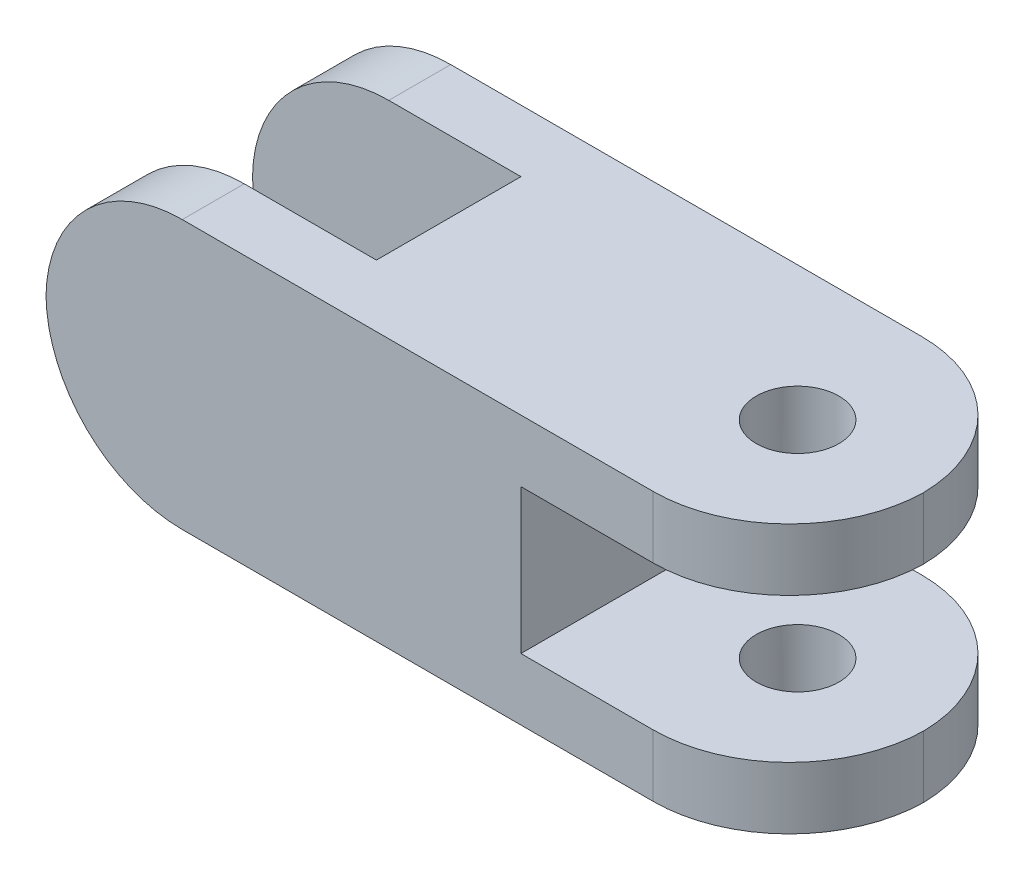
ISO-10303-21;
HEADER;
FILE_DESCRIPTION(('STEP AP214'),'2;1');
FILE_NAME('part.step','',(''),(''),'','','');
FILE_SCHEMA(('AUTOMOTIVE_DESIGN { 1 0 10303 214 1 1 1 1 }'));
ENDSEC;
DATA;
#1=APPLICATION_CONTEXT('core data for automotive mechanical design processes');
#2=APPLICATION_PROTOCOL_DEFINITION('international standard','automotive_design',2000,#1);
#3=PRODUCT_CONTEXT('',#1,'mechanical');
#4=PRODUCT('Part','Part','',(#3));
#5=PRODUCT_RELATED_PRODUCT_CATEGORY('part','',(#4));
#6=PRODUCT_DEFINITION_FORMATION('','',#4);
#7=PRODUCT_DEFINITION_CONTEXT('part definition',#1,'design');
#8=PRODUCT_DEFINITION('design','',#6,#7);
#9=PRODUCT_DEFINITION_SHAPE('','',#8);
#10=(LENGTH_UNIT() NAMED_UNIT(*) SI_UNIT(.MILLI.,.METRE.));
#11=(NAMED_UNIT(*) PLANE_ANGLE_UNIT() SI_UNIT($,.RADIAN.));
#12=(NAMED_UNIT(*) SI_UNIT($,.STERADIAN.) SOLID_ANGLE_UNIT());
#13=UNCERTAINTY_MEASURE_WITH_UNIT(LENGTH_MEASURE(1.E-05),#10,'distance_accuracy_value','');
#14=(GEOMETRIC_REPRESENTATION_CONTEXT(3) GLOBAL_UNCERTAINTY_ASSIGNED_CONTEXT((#13)) GLOBAL_UNIT_ASSIGNED_CONTEXT((#10,
#11,#12)) REPRESENTATION_CONTEXT('',''));
#15=CARTESIAN_POINT('',(0.,0.,0.));
#16=DIRECTION('',(0.,0.,1.));
#17=DIRECTION('',(1.,0.,0.));
#18=AXIS2_PLACEMENT_3D('',#15,#16,#17);
#19=CARTESIAN_POINT('',(-57.,-0.500000000000014,0.));
#20=DIRECTION('',(0.,0.,-1.));
#21=DIRECTION('',(-1.,0.,0.));
#22=AXIS2_PLACEMENT_3D('',#19,#20,#21);
#23=CYLINDRICAL_SURFACE('',#22,33.);
#24=DIRECTION('',(0.,0.,-1.));
#25=VECTOR('',#24,1.);
#26=CARTESIAN_POINT('',(-89.9962119037928,0.,0.));
#27=LINE('',#26,#25);
#28=CARTESIAN_POINT('',(-89.9962119037928,0.,-17.5));
#29=VERTEX_POINT('',#28);
#30=CARTESIAN_POINT('',(-89.9962119037928,0.,-32.5));
#31=VERTEX_POINT('',#30);
#32=EDGE_CURVE('E58',#29,#31,#27,.T.);
#33=ORIENTED_EDGE('',*,*,#32,.F.);
#34=CARTESIAN_POINT('',(-57.,-0.500000000000014,-17.5));
#35=DIRECTION('',(0.,0.,1.));
#36=DIRECTION('',(1.,0.,0.));
#37=AXIS2_PLACEMENT_3D('',#34,#35,#36);
#38=CIRCLE('',#37,33.);
#39=CARTESIAN_POINT('',(-57.,32.5,-17.5));
#40=VERTEX_POINT('',#39);
#41=EDGE_CURVE('E51',#29,#40,#38,.F.);
#42=ORIENTED_EDGE('',*,*,#41,.T.);
#43=DIRECTION('',(0.,0.,1.));
#44=VECTOR('',#43,1.);
#45=CARTESIAN_POINT('',(-57.,32.5,32.5));
#46=LINE('',#45,#44);
#47=CARTESIAN_POINT('',(-57.,32.5,-32.5));
#48=VERTEX_POINT('',#47);
#49=EDGE_CURVE('E266',#48,#40,#46,.T.);
#50=ORIENTED_EDGE('',*,*,#49,.F.);
#51=CARTESIAN_POINT('',(-57.,-0.500000000000014,-32.5));
#52=DIRECTION('',(0.,0.,1.));
#53=DIRECTION('',(1.,0.,0.));
#54=AXIS2_PLACEMENT_3D('',#51,#52,#53);
#55=CIRCLE('',#54,33.);
#56=EDGE_CURVE('E261',#31,#48,#55,.F.);
#57=ORIENTED_EDGE('',*,*,#56,.F.);
#58=EDGE_LOOP('',(#33,#42,#50,#57));
#59=FACE_BOUND('',#58,.T.);
#60=ADVANCED_FACE('F35',(#59),#23,.T.);
#61=CARTESIAN_POINT('',(-57.,0.500000000000014,-32.5));
#62=DIRECTION('',(0.,0.,1.));
#63=DIRECTION('',(1.,0.,0.));
#64=AXIS2_PLACEMENT_3D('',#61,#62,#63);
#65=CYLINDRICAL_SURFACE('',#64,33.);
#66=DIRECTION('',(0.,0.,1.));
#67=VECTOR('',#66,1.);
#68=CARTESIAN_POINT('',(-57.,-32.5,0.));
#69=LINE('',#68,#67);
#70=CARTESIAN_POINT('',(-57.,-32.5,-17.5));
#71=VERTEX_POINT('',#70);
#72=CARTESIAN_POINT('',(-57.,-32.5,-32.5));
#73=VERTEX_POINT('',#72);
#74=EDGE_CURVE('E259',#71,#73,#69,.F.);
#75=ORIENTED_EDGE('',*,*,#74,.F.);
#76=CARTESIAN_POINT('',(-57.,0.500000000000014,-17.5));
#77=DIRECTION('',(0.,0.,1.));
#78=DIRECTION('',(1.,0.,0.));
#79=AXIS2_PLACEMENT_3D('',#76,#77,#78);
#80=CIRCLE('',#79,33.);
#81=EDGE_CURVE('E44',#71,#29,#80,.F.);
#82=ORIENTED_EDGE('',*,*,#81,.T.);
#83=ORIENTED_EDGE('',*,*,#32,.T.);
#84=CARTESIAN_POINT('',(-57.,0.500000000000014,-32.5));
#85=DIRECTION('',(0.,0.,1.));
#86=DIRECTION('',(1.,0.,0.));
#87=AXIS2_PLACEMENT_3D('',#84,#85,#86);
#88=CIRCLE('',#87,33.);
#89=EDGE_CURVE('E263',#73,#31,#88,.F.);
#90=ORIENTED_EDGE('',*,*,#89,.F.);
#91=EDGE_LOOP('',(#75,#82,#83,#90));
#92=FACE_BOUND('',#91,.T.);
#93=ADVANCED_FACE('F272',(#92),#65,.T.);
#94=CARTESIAN_POINT('',(-90.,32.5,-32.5));
#95=DIRECTION('',(0.,0.,1.));
#96=DIRECTION('',(1.,0.,0.));
#97=AXIS2_PLACEMENT_3D('',#94,#95,#96);
#98=PLANE('',#97);
#99=DIRECTION('',(-1.,0.,0.));
#100=VECTOR('',#99,1.);
#101=CARTESIAN_POINT('',(-90.,-32.5,-32.5));
#102=LINE('',#101,#100);
#103=CARTESIAN_POINT('',(56.9999999999999,-32.5,-32.5));
#104=VERTEX_POINT('',#103);
#105=EDGE_CURVE('E223',#104,#73,#102,.T.);
#106=ORIENTED_EDGE('',*,*,#105,.T.);
#107=ORIENTED_EDGE('',*,*,#89,.T.);
#108=ORIENTED_EDGE('',*,*,#56,.T.);
#109=DIRECTION('',(-1.,0.,0.));
#110=VECTOR('',#109,1.);
#111=CARTESIAN_POINT('',(-90.,32.5,-32.5));
#112=LINE('',#111,#110);
#113=CARTESIAN_POINT('',(56.9999999999999,32.5,-32.5));
#114=VERTEX_POINT('',#113);
#115=EDGE_CURVE('E216',#114,#48,#112,.T.);
#116=ORIENTED_EDGE('',*,*,#115,.F.);
#117=DIRECTION('',(0.,-1.,0.));
#118=VECTOR('',#117,1.);
#119=CARTESIAN_POINT('',(57.,32.5,-32.5));
#120=LINE('',#119,#118);
#121=CARTESIAN_POINT('',(57.,17.5,-32.5));
#122=VERTEX_POINT('',#121);
#123=EDGE_CURVE('E228',#114,#122,#120,.T.);
#124=ORIENTED_EDGE('',*,*,#123,.T.);
#125=DIRECTION('',(-1.,0.,0.));
#126=VECTOR('',#125,1.);
#127=CARTESIAN_POINT('',(89.9962119037928,17.5,-32.5));
#128=LINE('',#127,#126);
#129=CARTESIAN_POINT('',(24.9962119037928,17.5,-32.5));
#130=VERTEX_POINT('',#129);
#131=EDGE_CURVE('E196',#122,#130,#128,.T.);
#132=ORIENTED_EDGE('',*,*,#131,.T.);
#133=DIRECTION('',(0.,-1.,0.));
#134=VECTOR('',#133,1.);
#135=CARTESIAN_POINT('',(24.9962119037928,17.5,-32.5));
#136=LINE('',#135,#134);
#137=CARTESIAN_POINT('',(24.9962119037928,-17.5,-32.5));
#138=VERTEX_POINT('',#137);
#139=EDGE_CURVE('E192',#130,#138,#136,.T.);
#140=ORIENTED_EDGE('',*,*,#139,.T.);
#141=DIRECTION('',(-1.,0.,0.));
#142=VECTOR('',#141,1.);
#143=CARTESIAN_POINT('',(89.9962119037928,-17.5,-32.5));
#144=LINE('',#143,#142);
#145=CARTESIAN_POINT('',(57.,-17.5,-32.5));
#146=VERTEX_POINT('',#145);
#147=EDGE_CURVE('E190',#146,#138,#144,.T.);
#148=ORIENTED_EDGE('',*,*,#147,.F.);
#149=EDGE_CURVE('E222',#146,#104,#120,.T.);
#150=ORIENTED_EDGE('',*,*,#149,.T.);
#151=EDGE_LOOP('',(#106,#107,#108,#116,#124,#132,#140,#148,#150));
#152=FACE_BOUND('',#151,.T.);
#153=ADVANCED_FACE('F278',(#152),#98,.F.);
#154=CARTESIAN_POINT('',(-90.,32.5,32.5));
#155=DIRECTION('',(0.,0.,-1.));
#156=DIRECTION('',(-1.,0.,0.));
#157=AXIS2_PLACEMENT_3D('',#154,#155,#156);
#158=PLANE('',#157);
#159=CARTESIAN_POINT('',(-57.,-0.500000000000014,32.5));
#160=DIRECTION('',(0.,0.,-1.));
#161=DIRECTION('',(-1.,0.,0.));
#162=AXIS2_PLACEMENT_3D('',#159,#160,#161);
#163=CIRCLE('',#162,33.);
#164=CARTESIAN_POINT('',(-57.,32.5,32.5));
#165=VERTEX_POINT('',#164);
#166=CARTESIAN_POINT('',(-89.9962119037928,0.,32.5));
#167=VERTEX_POINT('',#166);
#168=EDGE_CURVE('E255',#165,#167,#163,.F.);
#169=ORIENTED_EDGE('',*,*,#168,.T.);
#170=CARTESIAN_POINT('',(-57.,0.500000000000014,32.5));
#171=DIRECTION('',(0.,0.,-1.));
#172=DIRECTION('',(-1.,0.,0.));
#173=AXIS2_PLACEMENT_3D('',#170,#171,#172);
#174=CIRCLE('',#173,33.);
#175=CARTESIAN_POINT('',(-57.,-32.5,32.5));
#176=VERTEX_POINT('',#175);
#177=EDGE_CURVE('E257',#167,#176,#174,.F.);
#178=ORIENTED_EDGE('',*,*,#177,.T.);
#179=DIRECTION('',(1.,0.,0.));
#180=VECTOR('',#179,1.);
#181=CARTESIAN_POINT('',(-90.,-32.5,32.5));
#182=LINE('',#181,#180);
#183=CARTESIAN_POINT('',(56.9999999999999,-32.5,32.5));
#184=VERTEX_POINT('',#183);
#185=EDGE_CURVE('E220',#176,#184,#182,.T.);
#186=ORIENTED_EDGE('',*,*,#185,.T.);
#187=DIRECTION('',(0.,-1.,0.));
#188=VECTOR('',#187,1.);
#189=CARTESIAN_POINT('',(57.,32.5,32.5));
#190=LINE('',#189,#188);
#191=CARTESIAN_POINT('',(56.9999999999999,-17.5,32.5));
#192=VERTEX_POINT('',#191);
#193=EDGE_CURVE('E242',#184,#192,#190,.F.);
#194=ORIENTED_EDGE('',*,*,#193,.T.);
#195=DIRECTION('',(1.,0.,0.));
#196=VECTOR('',#195,1.);
#197=CARTESIAN_POINT('',(-90.,-17.5,32.5));
#198=LINE('',#197,#196);
#199=CARTESIAN_POINT('',(24.9962119037928,-17.5,32.5));
#200=VERTEX_POINT('',#199);
#201=EDGE_CURVE('E213',#200,#192,#198,.T.);
#202=ORIENTED_EDGE('',*,*,#201,.F.);
#203=DIRECTION('',(0.,1.,0.));
#204=VECTOR('',#203,1.);
#205=CARTESIAN_POINT('',(24.9962119037928,32.5,32.5));
#206=LINE('',#205,#204);
#207=CARTESIAN_POINT('',(24.9962119037928,17.5,32.5));
#208=VERTEX_POINT('',#207);
#209=EDGE_CURVE('E252',#200,#208,#206,.T.);
#210=ORIENTED_EDGE('',*,*,#209,.T.);
#211=DIRECTION('',(1.,0.,0.));
#212=VECTOR('',#211,1.);
#213=CARTESIAN_POINT('',(-90.,17.5,32.5));
#214=LINE('',#213,#212);
#215=CARTESIAN_POINT('',(56.9999999999999,17.5,32.5));
#216=VERTEX_POINT('',#215);
#217=EDGE_CURVE('E207',#208,#216,#214,.T.);
#218=ORIENTED_EDGE('',*,*,#217,.T.);
#219=CARTESIAN_POINT('',(56.9999999999999,32.5,32.5));
#220=VERTEX_POINT('',#219);
#221=EDGE_CURVE('E241',#216,#220,#190,.F.);
#222=ORIENTED_EDGE('',*,*,#221,.T.);
#223=DIRECTION('',(1.,0.,0.));
#224=VECTOR('',#223,1.);
#225=CARTESIAN_POINT('',(-90.,32.5,32.5));
#226=LINE('',#225,#224);
#227=EDGE_CURVE('E219',#165,#220,#226,.T.);
#228=ORIENTED_EDGE('',*,*,#227,.F.);
#229=EDGE_LOOP('',(#169,#178,#186,#194,#202,#210,#218,#222,#228));
#230=FACE_BOUND('',#229,.T.);
#231=ADVANCED_FACE('F300',(#230),#158,.F.);
#232=CARTESIAN_POINT('',(57.,32.5,-0.500000000000007));
#233=DIRECTION('',(0.,-1.,0.));
#234=DIRECTION('',(0.,0.,-1.));
#235=AXIS2_PLACEMENT_3D('',#232,#233,#234);
#236=CYLINDRICAL_SURFACE('',#235,33.);
#237=DIRECTION('',(0.,-1.,0.));
#238=VECTOR('',#237,1.);
#239=CARTESIAN_POINT('',(89.9962119037928,0.,-2.35922392732846E-13));
#240=LINE('',#239,#238);
#241=CARTESIAN_POINT('',(89.9962119037928,-17.5,3.95516952522712E-13));
#242=VERTEX_POINT('',#241);
#243=CARTESIAN_POINT('',(89.9962119037928,-32.5,-2.35813972515597E-13));
#244=VERTEX_POINT('',#243);
#245=EDGE_CURVE('E215',#242,#244,#240,.T.);
#246=ORIENTED_EDGE('',*,*,#245,.F.);
#247=CARTESIAN_POINT('',(57.,-17.5,-0.500000000000007));
#248=DIRECTION('',(0.,1.,0.));
#249=DIRECTION('',(-1.,0.,0.));
#250=AXIS2_PLACEMENT_3D('',#247,#248,#249);
#251=CIRCLE('',#250,33.);
#252=EDGE_CURVE('E210',#242,#192,#251,.F.);
#253=ORIENTED_EDGE('',*,*,#252,.T.);
#254=ORIENTED_EDGE('',*,*,#193,.F.);
#255=CARTESIAN_POINT('',(57.,-32.5,-0.500000000000007));
#256=DIRECTION('',(0.,1.,0.));
#257=DIRECTION('',(0.,0.,1.));
#258=AXIS2_PLACEMENT_3D('',#255,#256,#257);
#259=CIRCLE('',#258,33.);
#260=EDGE_CURVE('E231',#244,#184,#259,.F.);
#261=ORIENTED_EDGE('',*,*,#260,.F.);
#262=EDGE_LOOP('',(#246,#253,#254,#261));
#263=FACE_BOUND('',#262,.T.);
#264=ADVANCED_FACE('F305',(#263),#236,.T.);
#265=CARTESIAN_POINT('',(57.,32.5,0.499999999999994));
#266=DIRECTION('',(0.,-1.,0.));
#267=DIRECTION('',(0.,0.,-1.));
#268=AXIS2_PLACEMENT_3D('',#265,#266,#267);
#269=CYLINDRICAL_SURFACE('',#268,33.);
#270=ORIENTED_EDGE('',*,*,#149,.F.);
#271=CARTESIAN_POINT('',(57.,-17.5,0.499999999999994));
#272=DIRECTION('',(0.,1.,0.));
#273=DIRECTION('',(-1.,0.,0.));
#274=AXIS2_PLACEMENT_3D('',#271,#272,#273);
#275=CIRCLE('',#274,33.);
#276=EDGE_CURVE('E249',#146,#242,#275,.F.);
#277=ORIENTED_EDGE('',*,*,#276,.T.);
#278=ORIENTED_EDGE('',*,*,#245,.T.);
#279=CARTESIAN_POINT('',(57.,-32.5,0.499999999999994));
#280=DIRECTION('',(0.,1.,0.));
#281=DIRECTION('',(0.,0.,1.));
#282=AXIS2_PLACEMENT_3D('',#279,#280,#281);
#283=CIRCLE('',#282,33.);
#284=EDGE_CURVE('E234',#104,#244,#283,.F.);
#285=ORIENTED_EDGE('',*,*,#284,.F.);
#286=EDGE_LOOP('',(#270,#277,#278,#285));
#287=FACE_BOUND('',#286,.T.);
#288=ADVANCED_FACE('F308',(#287),#269,.T.);
#289=CARTESIAN_POINT('',(0.,32.5,0.));
#290=DIRECTION('',(0.,1.,0.));
#291=DIRECTION('',(0.,0.,1.));
#292=AXIS2_PLACEMENT_3D('',#289,#290,#291);
#293=PLANE('',#292);
#294=CARTESIAN_POINT('',(59.4857224316096,32.5,-2.25514051876985E-13));
#295=DIRECTION('',(0.,1.,0.));
#296=DIRECTION('',(0.,0.,1.));
#297=AXIS2_PLACEMENT_3D('',#294,#295,#296);
#298=CIRCLE('',#297,9.99999999999999);
#299=CARTESIAN_POINT('',(59.4857224316096,32.5,9.99999999999977));
#300=VERTEX_POINT('',#299);
#301=EDGE_CURVE('E180',#300,#300,#298,.T.);
#302=ORIENTED_EDGE('',*,*,#301,.F.);
#303=EDGE_LOOP('',(#302));
#304=FACE_BOUND('',#303,.T.);
#305=DIRECTION('',(1.,0.,0.));
#306=VECTOR('',#305,1.);
#307=CARTESIAN_POINT('',(-89.9962119037928,32.5,17.5));
#308=LINE('',#307,#306);
#309=CARTESIAN_POINT('',(-57.,32.5,17.5));
#310=VERTEX_POINT('',#309);
#311=CARTESIAN_POINT('',(-24.9962119037928,32.5,17.5));
#312=VERTEX_POINT('',#311);
#313=EDGE_CURVE('E167',#310,#312,#308,.T.);
#314=ORIENTED_EDGE('',*,*,#313,.F.);
#315=EDGE_CURVE('E265',#310,#165,#46,.T.);
#316=ORIENTED_EDGE('',*,*,#315,.T.);
#317=ORIENTED_EDGE('',*,*,#227,.T.);
#318=CARTESIAN_POINT('',(57.,32.5,-0.500000000000007));
#319=DIRECTION('',(0.,1.,0.));
#320=DIRECTION('',(0.,0.,1.));
#321=AXIS2_PLACEMENT_3D('',#318,#319,#320);
#322=CIRCLE('',#321,33.);
#323=CARTESIAN_POINT('',(89.9962119037928,32.5,-2.35813972515597E-13));
#324=VERTEX_POINT('',#323);
#325=EDGE_CURVE('E237',#220,#324,#322,.T.);
#326=ORIENTED_EDGE('',*,*,#325,.T.);
#327=CARTESIAN_POINT('',(57.,32.5,0.499999999999994));
#328=DIRECTION('',(0.,1.,0.));
#329=DIRECTION('',(0.,0.,1.));
#330=AXIS2_PLACEMENT_3D('',#327,#328,#329);
#331=CIRCLE('',#330,33.);
#332=EDGE_CURVE('E239',#324,#114,#331,.T.);
#333=ORIENTED_EDGE('',*,*,#332,.T.);
#334=ORIENTED_EDGE('',*,*,#115,.T.);
#335=ORIENTED_EDGE('',*,*,#49,.T.);
#336=DIRECTION('',(1.,0.,0.));
#337=VECTOR('',#336,1.);
#338=CARTESIAN_POINT('',(-89.9962119037928,32.5,-17.5));
#339=LINE('',#338,#337);
#340=CARTESIAN_POINT('',(-24.9962119037928,32.5,-17.5));
#341=VERTEX_POINT('',#340);
#342=EDGE_CURVE('E174',#40,#341,#339,.T.);
#343=ORIENTED_EDGE('',*,*,#342,.T.);
#344=DIRECTION('',(0.,0.,1.));
#345=VECTOR('',#344,1.);
#346=CARTESIAN_POINT('',(-24.9962119037928,32.5,-17.5));
#347=LINE('',#346,#345);
#348=EDGE_CURVE('E177',#341,#312,#347,.T.);
#349=ORIENTED_EDGE('',*,*,#348,.T.);
#350=EDGE_LOOP('',(#314,#316,#317,#326,#333,#334,#335,#343,#349));
#351=FACE_BOUND('',#350,.T.);
#352=ADVANCED_FACE('F281',(#304,#351),#293,.T.);
#353=CARTESIAN_POINT('',(0.,-32.5,0.));
#354=DIRECTION('',(0.,1.,0.));
#355=DIRECTION('',(0.,0.,1.));
#356=AXIS2_PLACEMENT_3D('',#353,#354,#355);
#357=PLANE('',#356);
#358=CARTESIAN_POINT('',(59.4857224316096,-32.5,-2.25514051876985E-13));
#359=DIRECTION('',(0.,1.,0.));
#360=DIRECTION('',(0.,0.,1.));
#361=AXIS2_PLACEMENT_3D('',#358,#359,#360);
#362=CIRCLE('',#361,9.99999999999999);
#363=CARTESIAN_POINT('',(59.4857224316096,-32.5,9.99999999999977));
#364=VERTEX_POINT('',#363);
#365=EDGE_CURVE('E470',#364,#364,#362,.T.);
#366=ORIENTED_EDGE('',*,*,#365,.T.);
#367=EDGE_LOOP('',(#366));
#368=FACE_BOUND('',#367,.T.);
#369=CARTESIAN_POINT('',(-57.,-32.5,17.5));
#370=VERTEX_POINT('',#369);
#371=EDGE_CURVE('E173',#176,#370,#69,.F.);
#372=ORIENTED_EDGE('',*,*,#371,.T.);
#373=DIRECTION('',(1.,0.,0.));
#374=VECTOR('',#373,1.);
#375=CARTESIAN_POINT('',(-89.9962119037928,-32.5,17.5));
#376=LINE('',#375,#374);
#377=CARTESIAN_POINT('',(-24.9962119037928,-32.5,17.5));
#378=VERTEX_POINT('',#377);
#379=EDGE_CURVE('E161',#370,#378,#376,.T.);
#380=ORIENTED_EDGE('',*,*,#379,.T.);
#381=DIRECTION('',(0.,0.,1.));
#382=VECTOR('',#381,1.);
#383=CARTESIAN_POINT('',(-24.9962119037928,-32.5,-17.5));
#384=LINE('',#383,#382);
#385=CARTESIAN_POINT('',(-24.9962119037928,-32.5,-17.5));
#386=VERTEX_POINT('',#385);
#387=EDGE_CURVE('E150',#386,#378,#384,.T.);
#388=ORIENTED_EDGE('',*,*,#387,.F.);
#389=DIRECTION('',(1.,0.,0.));
#390=VECTOR('',#389,1.);
#391=CARTESIAN_POINT('',(-89.9962119037928,-32.5,-17.5));
#392=LINE('',#391,#390);
#393=EDGE_CURVE('E160',#71,#386,#392,.T.);
#394=ORIENTED_EDGE('',*,*,#393,.F.);
#395=ORIENTED_EDGE('',*,*,#74,.T.);
#396=ORIENTED_EDGE('',*,*,#105,.F.);
#397=ORIENTED_EDGE('',*,*,#284,.T.);
#398=ORIENTED_EDGE('',*,*,#260,.T.);
#399=ORIENTED_EDGE('',*,*,#185,.F.);
#400=EDGE_LOOP('',(#372,#380,#388,#394,#395,#396,#397,#398,#399));
#401=FACE_BOUND('',#400,.T.);
#402=ADVANCED_FACE('F170',(#368,#401),#357,.F.);
#403=CARTESIAN_POINT('',(57.,17.5,-0.500000000000007));
#404=DIRECTION('',(0.,1.,0.));
#405=DIRECTION('',(-1.,0.,0.));
#406=AXIS2_PLACEMENT_3D('',#403,#404,#405);
#407=CIRCLE('',#406,33.);
#408=CARTESIAN_POINT('',(89.9962119037928,17.5,3.95516952522712E-13));
#409=VERTEX_POINT('',#408);
#410=EDGE_CURVE('E205',#409,#216,#407,.F.);
#411=ORIENTED_EDGE('',*,*,#410,.F.);
#412=EDGE_CURVE('E226',#324,#409,#240,.T.);
#413=ORIENTED_EDGE('',*,*,#412,.F.);
#414=ORIENTED_EDGE('',*,*,#325,.F.);
#415=ORIENTED_EDGE('',*,*,#221,.F.);
#416=EDGE_LOOP('',(#411,#413,#414,#415));
#417=FACE_BOUND('',#416,.T.);
#418=ADVANCED_FACE('F322',(#417),#236,.T.);
#419=CARTESIAN_POINT('',(57.,17.5,0.499999999999994));
#420=DIRECTION('',(0.,1.,0.));
#421=DIRECTION('',(-1.,0.,0.));
#422=AXIS2_PLACEMENT_3D('',#419,#420,#421);
#423=CIRCLE('',#422,33.);
#424=EDGE_CURVE('E245',#122,#409,#423,.F.);
#425=ORIENTED_EDGE('',*,*,#424,.F.);
#426=ORIENTED_EDGE('',*,*,#123,.F.);
#427=ORIENTED_EDGE('',*,*,#332,.F.);
#428=ORIENTED_EDGE('',*,*,#412,.T.);
#429=EDGE_LOOP('',(#425,#426,#427,#428));
#430=FACE_BOUND('',#429,.T.);
#431=ADVANCED_FACE('F287',(#430),#269,.T.);
#432=CARTESIAN_POINT('',(24.9962119037928,17.5,-32.5));
#433=DIRECTION('',(-1.,0.,0.));
#434=DIRECTION('',(0.,0.,1.));
#435=AXIS2_PLACEMENT_3D('',#432,#433,#434);
#436=PLANE('',#435);
#437=DIRECTION('',(0.,0.,1.));
#438=VECTOR('',#437,1.);
#439=CARTESIAN_POINT('',(24.9962119037928,-17.5,-32.5));
#440=LINE('',#439,#438);
#441=EDGE_CURVE('E202',#138,#200,#440,.T.);
#442=ORIENTED_EDGE('',*,*,#441,.F.);
#443=ORIENTED_EDGE('',*,*,#139,.F.);
#444=DIRECTION('',(0.,0.,1.));
#445=VECTOR('',#444,1.);
#446=CARTESIAN_POINT('',(24.9962119037928,17.5,-32.5));
#447=LINE('',#446,#445);
#448=EDGE_CURVE('E199',#130,#208,#447,.T.);
#449=ORIENTED_EDGE('',*,*,#448,.T.);
#450=ORIENTED_EDGE('',*,*,#209,.F.);
#451=EDGE_LOOP('',(#442,#443,#449,#450));
#452=FACE_BOUND('',#451,.T.);
#453=ADVANCED_FACE('F295',(#452),#436,.F.);
#454=CARTESIAN_POINT('',(89.9962119037928,-17.5,-32.5));
#455=DIRECTION('',(0.,1.,0.));
#456=DIRECTION('',(-1.,0.,0.));
#457=AXIS2_PLACEMENT_3D('',#454,#455,#456);
#458=PLANE('',#457);
#459=CARTESIAN_POINT('',(59.4857224316096,-17.5,-2.25514051876985E-13));
#460=DIRECTION('',(0.,1.,0.));
#461=DIRECTION('',(-1.,0.,0.));
#462=AXIS2_PLACEMENT_3D('',#459,#460,#461);
#463=CIRCLE('',#462,9.99999999999999);
#464=CARTESIAN_POINT('',(49.4857224316096,-17.5,-2.25514051876985E-13));
#465=VERTEX_POINT('',#464);
#466=EDGE_CURVE('E467',#465,#465,#463,.T.);
#467=ORIENTED_EDGE('',*,*,#466,.F.);
#468=EDGE_LOOP('',(#467));
#469=FACE_BOUND('',#468,.T.);
#470=ORIENTED_EDGE('',*,*,#201,.T.);
#471=ORIENTED_EDGE('',*,*,#252,.F.);
#472=ORIENTED_EDGE('',*,*,#276,.F.);
#473=ORIENTED_EDGE('',*,*,#147,.T.);
#474=ORIENTED_EDGE('',*,*,#441,.T.);
#475=EDGE_LOOP('',(#470,#471,#472,#473,#474));
#476=FACE_BOUND('',#475,.T.);
#477=ADVANCED_FACE('F298',(#469,#476),#458,.T.);
#478=CARTESIAN_POINT('',(89.9962119037928,17.5,-32.5));
#479=DIRECTION('',(0.,1.,0.));
#480=DIRECTION('',(-1.,0.,0.));
#481=AXIS2_PLACEMENT_3D('',#478,#479,#480);
#482=PLANE('',#481);
#483=CARTESIAN_POINT('',(59.4857224316096,17.5,-2.25514051876985E-13));
#484=DIRECTION('',(0.,1.,0.));
#485=DIRECTION('',(-1.,0.,0.));
#486=AXIS2_PLACEMENT_3D('',#483,#484,#485);
#487=CIRCLE('',#486,9.99999999999999);
#488=CARTESIAN_POINT('',(49.4857224316096,17.5,-2.25514051876985E-13));
#489=VERTEX_POINT('',#488);
#490=EDGE_CURVE('E39',#489,#489,#487,.T.);
#491=ORIENTED_EDGE('',*,*,#490,.T.);
#492=EDGE_LOOP('',(#491));
#493=FACE_BOUND('',#492,.T.);
#494=ORIENTED_EDGE('',*,*,#448,.F.);
#495=ORIENTED_EDGE('',*,*,#131,.F.);
#496=ORIENTED_EDGE('',*,*,#424,.T.);
#497=ORIENTED_EDGE('',*,*,#410,.T.);
#498=ORIENTED_EDGE('',*,*,#217,.F.);
#499=EDGE_LOOP('',(#494,#495,#496,#497,#498));
#500=FACE_BOUND('',#499,.T.);
#501=ADVANCED_FACE('F291',(#493,#500),#482,.F.);
#502=CARTESIAN_POINT('',(-57.,-0.500000000000014,17.5));
#503=DIRECTION('',(0.,0.,1.));
#504=DIRECTION('',(1.,0.,0.));
#505=AXIS2_PLACEMENT_3D('',#502,#503,#504);
#506=CIRCLE('',#505,33.);
#507=CARTESIAN_POINT('',(-89.9962119037928,-1.31838984174237E-12,17.5));
#508=VERTEX_POINT('',#507);
#509=EDGE_CURVE('E188',#508,#310,#506,.F.);
#510=ORIENTED_EDGE('',*,*,#509,.F.);
#511=EDGE_CURVE('E193',#167,#508,#27,.T.);
#512=ORIENTED_EDGE('',*,*,#511,.F.);
#513=ORIENTED_EDGE('',*,*,#168,.F.);
#514=ORIENTED_EDGE('',*,*,#315,.F.);
#515=EDGE_LOOP('',(#510,#512,#513,#514));
#516=FACE_BOUND('',#515,.T.);
#517=ADVANCED_FACE('F37',(#516),#23,.T.);
#518=CARTESIAN_POINT('',(-57.,0.500000000000014,17.5));
#519=DIRECTION('',(0.,0.,1.));
#520=DIRECTION('',(1.,0.,0.));
#521=AXIS2_PLACEMENT_3D('',#518,#519,#520);
#522=CIRCLE('',#521,33.);
#523=EDGE_CURVE('E11',#370,#508,#522,.F.);
#524=ORIENTED_EDGE('',*,*,#523,.F.);
#525=ORIENTED_EDGE('',*,*,#371,.F.);
#526=ORIENTED_EDGE('',*,*,#177,.F.);
#527=ORIENTED_EDGE('',*,*,#511,.T.);
#528=EDGE_LOOP('',(#524,#525,#526,#527));
#529=FACE_BOUND('',#528,.T.);
#530=ADVANCED_FACE('F337',(#529),#65,.T.);
#531=CARTESIAN_POINT('',(-89.9962119037928,-32.5,17.5));
#532=DIRECTION('',(0.,0.,1.));
#533=DIRECTION('',(1.,0.,0.));
#534=AXIS2_PLACEMENT_3D('',#531,#532,#533);
#535=PLANE('',#534);
#536=ORIENTED_EDGE('',*,*,#509,.T.);
#537=ORIENTED_EDGE('',*,*,#313,.T.);
#538=DIRECTION('',(0.,1.,0.));
#539=VECTOR('',#538,1.);
#540=CARTESIAN_POINT('',(-24.9962119037928,-32.5,17.5));
#541=LINE('',#540,#539);
#542=EDGE_CURVE('E154',#378,#312,#541,.T.);
#543=ORIENTED_EDGE('',*,*,#542,.F.);
#544=ORIENTED_EDGE('',*,*,#379,.F.);
#545=ORIENTED_EDGE('',*,*,#523,.T.);
#546=EDGE_LOOP('',(#536,#537,#543,#544,#545));
#547=FACE_BOUND('',#546,.T.);
#548=ADVANCED_FACE('F164',(#547),#535,.F.);
#549=CARTESIAN_POINT('',(-89.9962119037928,-32.5,-17.5));
#550=DIRECTION('',(0.,0.,1.));
#551=DIRECTION('',(1.,0.,0.));
#552=AXIS2_PLACEMENT_3D('',#549,#550,#551);
#553=PLANE('',#552);
#554=ORIENTED_EDGE('',*,*,#81,.F.);
#555=ORIENTED_EDGE('',*,*,#393,.T.);
#556=DIRECTION('',(0.,1.,0.));
#557=VECTOR('',#556,1.);
#558=CARTESIAN_POINT('',(-24.9962119037928,-32.5,-17.5));
#559=LINE('',#558,#557);
#560=EDGE_CURVE('E156',#386,#341,#559,.T.);
#561=ORIENTED_EDGE('',*,*,#560,.T.);
#562=ORIENTED_EDGE('',*,*,#342,.F.);
#563=ORIENTED_EDGE('',*,*,#41,.F.);
#564=EDGE_LOOP('',(#554,#555,#561,#562,#563));
#565=FACE_BOUND('',#564,.T.);
#566=ADVANCED_FACE('F311',(#565),#553,.T.);
#567=CARTESIAN_POINT('',(-24.9962119037928,-32.5,-17.5));
#568=DIRECTION('',(-1.,0.,0.));
#569=DIRECTION('',(0.,0.,1.));
#570=AXIS2_PLACEMENT_3D('',#567,#568,#569);
#571=PLANE('',#570);
#572=ORIENTED_EDGE('',*,*,#348,.F.);
#573=ORIENTED_EDGE('',*,*,#560,.F.);
#574=ORIENTED_EDGE('',*,*,#387,.T.);
#575=ORIENTED_EDGE('',*,*,#542,.T.);
#576=EDGE_LOOP('',(#572,#573,#574,#575));
#577=FACE_BOUND('',#576,.T.);
#578=ADVANCED_FACE('F153',(#577),#571,.T.);
#579=CARTESIAN_POINT('',(59.4857224316096,-32.5,-2.25514051876985E-13));
#580=DIRECTION('',(0.,1.,0.));
#581=DIRECTION('',(0.,0.,1.));
#582=AXIS2_PLACEMENT_3D('',#579,#580,#581);
#583=CYLINDRICAL_SURFACE('',#582,9.99999999999999);
#584=ORIENTED_EDGE('',*,*,#301,.T.);
#585=EDGE_LOOP('',(#584));
#586=FACE_BOUND('',#585,.T.);
#587=ORIENTED_EDGE('',*,*,#490,.F.);
#588=EDGE_LOOP('',(#587));
#589=FACE_BOUND('',#588,.T.);
#590=ADVANCED_FACE('F408',(#586,#589),#583,.F.);
#591=ORIENTED_EDGE('',*,*,#466,.T.);
#592=EDGE_LOOP('',(#591));
#593=FACE_BOUND('',#592,.T.);
#594=ORIENTED_EDGE('',*,*,#365,.F.);
#595=EDGE_LOOP('',(#594));
#596=FACE_BOUND('',#595,.T.);
#597=ADVANCED_FACE('F413',(#593,#596),#583,.F.);
#598=CLOSED_SHELL('',(#60,#93,#153,#231,#264,#288,#352,#402,#418,#431,#453,#477,#501,#517,#530,
#548,#566,#578,#590,#597));
#599=MANIFOLD_SOLID_BREP('B2',#598);
#600=ADVANCED_BREP_SHAPE_REPRESENTATION('',(#18,#599),#14);
#601=SHAPE_DEFINITION_REPRESENTATION(#9,#600);
ENDSEC;
END-ISO-10303-21;
